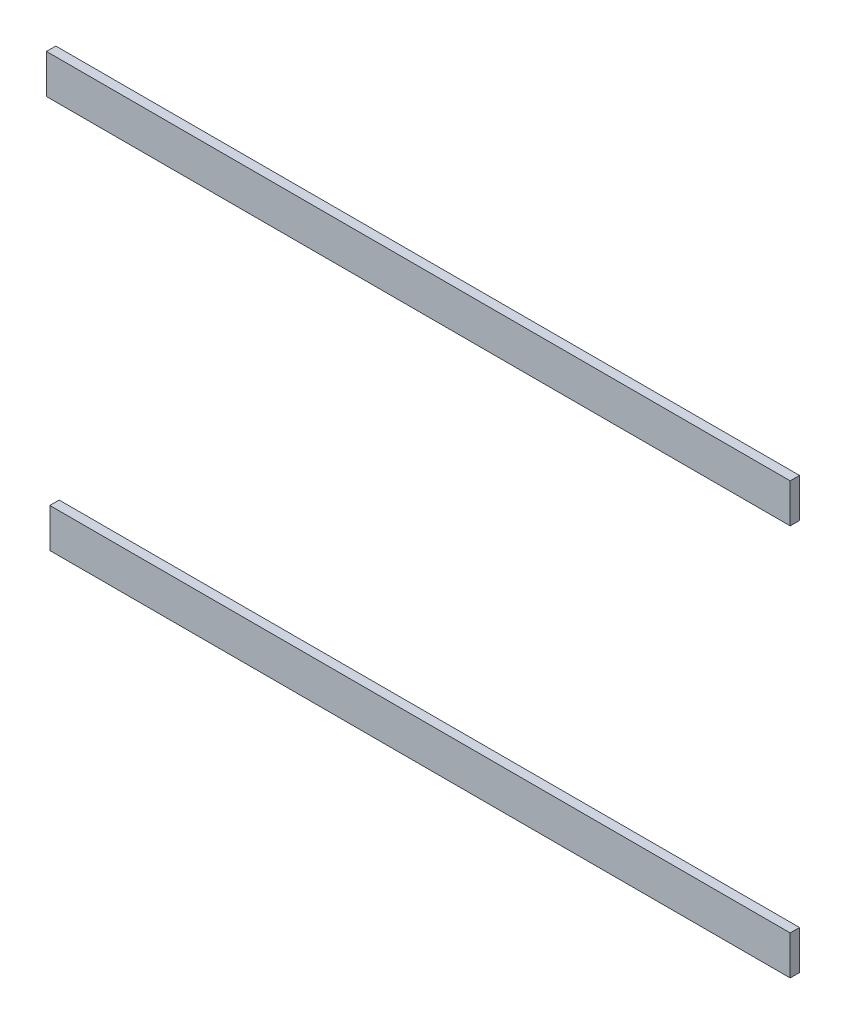
ISO-10303-21;
HEADER;
FILE_DESCRIPTION(('STEP AP214'),'2;1');
FILE_NAME('part.step','',(''),(''),'','','');
FILE_SCHEMA(('AUTOMOTIVE_DESIGN { 1 0 10303 214 1 1 1 1 }'));
ENDSEC;
DATA;
#1=APPLICATION_CONTEXT('core data for automotive mechanical design processes');
#2=APPLICATION_PROTOCOL_DEFINITION('international standard','automotive_design',2000,#1);
#3=PRODUCT_CONTEXT('',#1,'mechanical');
#4=PRODUCT('Part','Part','',(#3));
#5=PRODUCT_RELATED_PRODUCT_CATEGORY('part','',(#4));
#6=PRODUCT_DEFINITION_FORMATION('','',#4);
#7=PRODUCT_DEFINITION_CONTEXT('part definition',#1,'design');
#8=PRODUCT_DEFINITION('design','',#6,#7);
#9=PRODUCT_DEFINITION_SHAPE('','',#8);
#10=(LENGTH_UNIT() NAMED_UNIT(*) SI_UNIT(.MILLI.,.METRE.));
#11=(NAMED_UNIT(*) PLANE_ANGLE_UNIT() SI_UNIT($,.RADIAN.));
#12=(NAMED_UNIT(*) SI_UNIT($,.STERADIAN.) SOLID_ANGLE_UNIT());
#13=UNCERTAINTY_MEASURE_WITH_UNIT(LENGTH_MEASURE(1.E-05),#10,'distance_accuracy_value','');
#14=(GEOMETRIC_REPRESENTATION_CONTEXT(3) GLOBAL_UNCERTAINTY_ASSIGNED_CONTEXT((#13)) GLOBAL_UNIT_ASSIGNED_CONTEXT((#10,
#11,#12)) REPRESENTATION_CONTEXT('',''));
#15=CARTESIAN_POINT('',(0.,0.,0.));
#16=DIRECTION('',(0.,0.,1.));
#17=DIRECTION('',(1.,0.,0.));
#18=AXIS2_PLACEMENT_3D('',#15,#16,#17);
#19=CARTESIAN_POINT('',(0.,0.,1.2));
#20=DIRECTION('',(0.,0.,1.));
#21=DIRECTION('',(1.,0.,0.));
#22=AXIS2_PLACEMENT_3D('',#19,#20,#21);
#23=PLANE('',#22);
#24=DIRECTION('',(0.,-1.,0.));
#25=VECTOR('',#24,1.);
#26=CARTESIAN_POINT('',(-2.327676679514,60.577046,1.2));
#27=LINE('',#26,#25);
#28=CARTESIAN_POINT('',(-2.327676679514,60.577046,1.2));
#29=VERTEX_POINT('',#28);
#30=CARTESIAN_POINT('',(-2.327676679514,55.577046,1.2));
#31=VERTEX_POINT('',#30);
#32=EDGE_CURVE('P0_E11',#29,#31,#27,.T.);
#33=ORIENTED_EDGE('',*,*,#32,.T.);
#34=DIRECTION('',(1.,0.,0.));
#35=VECTOR('',#34,1.);
#36=CARTESIAN_POINT('',(-2.327676679514,55.577046,1.2));
#37=LINE('',#36,#35);
#38=CARTESIAN_POINT('',(92.92950262011,55.577046,1.2));
#39=VERTEX_POINT('',#38);
#40=EDGE_CURVE('P0_E20',#31,#39,#37,.T.);
#41=ORIENTED_EDGE('',*,*,#40,.T.);
#42=DIRECTION('',(0.,1.,0.));
#43=VECTOR('',#42,1.);
#44=CARTESIAN_POINT('',(92.92950262011,55.577046,1.2));
#45=LINE('',#44,#43);
#46=CARTESIAN_POINT('',(92.92950262011,60.577046,1.2));
#47=VERTEX_POINT('',#46);
#48=EDGE_CURVE('P0_E51',#39,#47,#45,.T.);
#49=ORIENTED_EDGE('',*,*,#48,.T.);
#50=DIRECTION('',(-1.,0.,0.));
#51=VECTOR('',#50,1.);
#52=CARTESIAN_POINT('',(92.92950262011,60.577046,1.2));
#53=LINE('',#52,#51);
#54=EDGE_CURVE('P0_E54',#47,#29,#53,.T.);
#55=ORIENTED_EDGE('',*,*,#54,.T.);
#56=EDGE_LOOP('',(#33,#41,#49,#55));
#57=FACE_BOUND('',#56,.T.);
#58=ADVANCED_FACE('P0_F17',(#57),#23,.T.);
#59=CARTESIAN_POINT('',(-2.327676679514,60.577046,0.));
#60=DIRECTION('',(-1.,0.,0.));
#61=DIRECTION('',(0.,0.,1.));
#62=AXIS2_PLACEMENT_3D('',#59,#60,#61);
#63=PLANE('',#62);
#64=DIRECTION('',(0.,0.,1.));
#65=VECTOR('',#64,1.);
#66=CARTESIAN_POINT('',(-2.327676679514,55.577046,0.));
#67=LINE('',#66,#65);
#68=CARTESIAN_POINT('',(-2.327676679514,55.577046,0.));
#69=VERTEX_POINT('',#68);
#70=EDGE_CURVE('P0_E27',#69,#31,#67,.T.);
#71=ORIENTED_EDGE('',*,*,#70,.T.);
#72=ORIENTED_EDGE('',*,*,#32,.F.);
#73=DIRECTION('',(0.,0.,1.));
#74=VECTOR('',#73,1.);
#75=CARTESIAN_POINT('',(-2.327676679514,60.577046,0.));
#76=LINE('',#75,#74);
#77=CARTESIAN_POINT('',(-2.327676679514,60.577046,0.));
#78=VERTEX_POINT('',#77);
#79=EDGE_CURVE('P0_E77',#78,#29,#76,.T.);
#80=ORIENTED_EDGE('',*,*,#79,.F.);
#81=DIRECTION('',(0.,-1.,0.));
#82=VECTOR('',#81,1.);
#83=CARTESIAN_POINT('',(-2.327676679514,60.577046,0.));
#84=LINE('',#83,#82);
#85=EDGE_CURVE('P0_E108',#78,#69,#84,.T.);
#86=ORIENTED_EDGE('',*,*,#85,.T.);
#87=EDGE_LOOP('',(#71,#72,#80,#86));
#88=FACE_BOUND('',#87,.T.);
#89=ADVANCED_FACE('P0_F118',(#88),#63,.T.);
#90=CARTESIAN_POINT('',(-2.327676679514,55.577046,0.));
#91=DIRECTION('',(0.,-1.,0.));
#92=DIRECTION('',(0.,0.,-1.));
#93=AXIS2_PLACEMENT_3D('',#90,#91,#92);
#94=PLANE('',#93);
#95=DIRECTION('',(0.,0.,1.));
#96=VECTOR('',#95,1.);
#97=CARTESIAN_POINT('',(92.92950262011,55.577046,0.));
#98=LINE('',#97,#96);
#99=CARTESIAN_POINT('',(92.92950262011,55.577046,0.));
#100=VERTEX_POINT('',#99);
#101=EDGE_CURVE('P0_E61',#100,#39,#98,.T.);
#102=ORIENTED_EDGE('',*,*,#101,.T.);
#103=ORIENTED_EDGE('',*,*,#40,.F.);
#104=ORIENTED_EDGE('',*,*,#70,.F.);
#105=DIRECTION('',(1.,0.,0.));
#106=VECTOR('',#105,1.);
#107=CARTESIAN_POINT('',(-2.327676679514,55.577046,0.));
#108=LINE('',#107,#106);
#109=EDGE_CURVE('P0_E105',#69,#100,#108,.T.);
#110=ORIENTED_EDGE('',*,*,#109,.T.);
#111=EDGE_LOOP('',(#102,#103,#104,#110));
#112=FACE_BOUND('',#111,.T.);
#113=ADVANCED_FACE('P0_F128',(#112),#94,.T.);
#114=CARTESIAN_POINT('',(92.92950262011,55.577046,0.));
#115=DIRECTION('',(1.,0.,0.));
#116=DIRECTION('',(0.,1.,0.));
#117=AXIS2_PLACEMENT_3D('',#114,#115,#116);
#118=PLANE('',#117);
#119=DIRECTION('',(0.,0.,1.));
#120=VECTOR('',#119,1.);
#121=CARTESIAN_POINT('',(92.92950262011,60.577046,0.));
#122=LINE('',#121,#120);
#123=CARTESIAN_POINT('',(92.92950262011,60.577046,0.));
#124=VERTEX_POINT('',#123);
#125=EDGE_CURVE('P0_E62',#124,#47,#122,.T.);
#126=ORIENTED_EDGE('',*,*,#125,.T.);
#127=ORIENTED_EDGE('',*,*,#48,.F.);
#128=ORIENTED_EDGE('',*,*,#101,.F.);
#129=DIRECTION('',(0.,1.,0.));
#130=VECTOR('',#129,1.);
#131=CARTESIAN_POINT('',(92.92950262011,55.577046,0.));
#132=LINE('',#131,#130);
#133=EDGE_CURVE('P0_E69',#100,#124,#132,.T.);
#134=ORIENTED_EDGE('',*,*,#133,.T.);
#135=EDGE_LOOP('',(#126,#127,#128,#134));
#136=FACE_BOUND('',#135,.T.);
#137=ADVANCED_FACE('P0_F66',(#136),#118,.T.);
#138=CARTESIAN_POINT('',(92.92950262011,60.577046,0.));
#139=DIRECTION('',(0.,1.,0.));
#140=DIRECTION('',(1.,0.,0.));
#141=AXIS2_PLACEMENT_3D('',#138,#139,#140);
#142=PLANE('',#141);
#143=ORIENTED_EDGE('',*,*,#79,.T.);
#144=ORIENTED_EDGE('',*,*,#54,.F.);
#145=ORIENTED_EDGE('',*,*,#125,.F.);
#146=DIRECTION('',(-1.,0.,0.));
#147=VECTOR('',#146,1.);
#148=CARTESIAN_POINT('',(92.92950262011,60.577046,0.));
#149=LINE('',#148,#147);
#150=EDGE_CURVE('P0_E84',#124,#78,#149,.T.);
#151=ORIENTED_EDGE('',*,*,#150,.T.);
#152=EDGE_LOOP('',(#143,#144,#145,#151));
#153=FACE_BOUND('',#152,.T.);
#154=ADVANCED_FACE('P0_F75',(#153),#142,.T.);
#155=CARTESIAN_POINT('',(0.,0.,0.));
#156=DIRECTION('',(0.,0.,1.));
#157=DIRECTION('',(1.,0.,0.));
#158=AXIS2_PLACEMENT_3D('',#155,#156,#157);
#159=PLANE('',#158);
#160=ORIENTED_EDGE('',*,*,#133,.F.);
#161=ORIENTED_EDGE('',*,*,#109,.F.);
#162=ORIENTED_EDGE('',*,*,#85,.F.);
#163=ORIENTED_EDGE('',*,*,#150,.F.);
#164=EDGE_LOOP('',(#160,#161,#162,#163));
#165=FACE_BOUND('',#164,.T.);
#166=ADVANCED_FACE('P0_F117',(#165),#159,.F.);
#167=CLOSED_SHELL('',(#58,#89,#113,#137,#154,#166));
#168=MANIFOLD_SOLID_BREP('P0_B1',#167);
#169=CARTESIAN_POINT('',(0.,0.,1.2));
#170=DIRECTION('',(0.,0.,1.));
#171=DIRECTION('',(1.,0.,0.));
#172=AXIS2_PLACEMENT_3D('',#169,#170,#171);
#173=PLANE('',#172);
#174=DIRECTION('',(0.,1.,0.));
#175=VECTOR('',#174,1.);
#176=CARTESIAN_POINT('',(92.92950262011,5.437046,1.2));
#177=LINE('',#176,#175);
#178=CARTESIAN_POINT('',(92.92950262011,5.437046,1.2));
#179=VERTEX_POINT('',#178);
#180=CARTESIAN_POINT('',(92.92950262011,10.437046,1.2));
#181=VERTEX_POINT('',#180);
#182=EDGE_CURVE('P1_E11',#179,#181,#177,.T.);
#183=ORIENTED_EDGE('',*,*,#182,.T.);
#184=DIRECTION('',(-1.,0.,0.));
#185=VECTOR('',#184,1.);
#186=CARTESIAN_POINT('',(92.92950262011,10.437046,1.2));
#187=LINE('',#186,#185);
#188=CARTESIAN_POINT('',(-1.895589174785,10.437046,1.2));
#189=VERTEX_POINT('',#188);
#190=EDGE_CURVE('P1_E44',#181,#189,#187,.T.);
#191=ORIENTED_EDGE('',*,*,#190,.T.);
#192=DIRECTION('',(0.,-1.,0.));
#193=VECTOR('',#192,1.);
#194=CARTESIAN_POINT('',(-1.895589174785,10.437046,1.2));
#195=LINE('',#194,#193);
#196=CARTESIAN_POINT('',(-1.895589174785,5.437046,1.2));
#197=VERTEX_POINT('',#196);
#198=EDGE_CURVE('P1_E109',#189,#197,#195,.T.);
#199=ORIENTED_EDGE('',*,*,#198,.T.);
#200=DIRECTION('',(1.,0.,0.));
#201=VECTOR('',#200,1.);
#202=CARTESIAN_POINT('',(-1.895589174785,5.437046,1.2));
#203=LINE('',#202,#201);
#204=EDGE_CURVE('P1_E99',#197,#179,#203,.T.);
#205=ORIENTED_EDGE('',*,*,#204,.T.);
#206=EDGE_LOOP('',(#183,#191,#199,#205));
#207=FACE_BOUND('',#206,.T.);
#208=ADVANCED_FACE('P1_F17',(#207),#173,.T.);
#209=CARTESIAN_POINT('',(92.92950262011,5.437046,0.));
#210=DIRECTION('',(1.,0.,0.));
#211=DIRECTION('',(0.,1.,0.));
#212=AXIS2_PLACEMENT_3D('',#209,#210,#211);
#213=PLANE('',#212);
#214=DIRECTION('',(0.,0.,1.));
#215=VECTOR('',#214,1.);
#216=CARTESIAN_POINT('',(92.92950262011,10.437046,0.));
#217=LINE('',#216,#215);
#218=CARTESIAN_POINT('',(92.92950262011,10.437046,0.));
#219=VERTEX_POINT('',#218);
#220=EDGE_CURVE('P1_E21',#219,#181,#217,.T.);
#221=ORIENTED_EDGE('',*,*,#220,.T.);
#222=ORIENTED_EDGE('',*,*,#182,.F.);
#223=DIRECTION('',(0.,0.,1.));
#224=VECTOR('',#223,1.);
#225=CARTESIAN_POINT('',(92.92950262011,5.437046,0.));
#226=LINE('',#225,#224);
#227=CARTESIAN_POINT('',(92.92950262011,5.437046,0.));
#228=VERTEX_POINT('',#227);
#229=EDGE_CURVE('P1_E80',#228,#179,#226,.T.);
#230=ORIENTED_EDGE('',*,*,#229,.F.);
#231=DIRECTION('',(0.,1.,0.));
#232=VECTOR('',#231,1.);
#233=CARTESIAN_POINT('',(92.92950262011,5.437046,0.));
#234=LINE('',#233,#232);
#235=EDGE_CURVE('P1_E78',#228,#219,#234,.T.);
#236=ORIENTED_EDGE('',*,*,#235,.T.);
#237=EDGE_LOOP('',(#221,#222,#230,#236));
#238=FACE_BOUND('',#237,.T.);
#239=ADVANCED_FACE('P1_F19',(#238),#213,.T.);
#240=CARTESIAN_POINT('',(92.92950262011,10.437046,0.));
#241=DIRECTION('',(0.,1.,0.));
#242=DIRECTION('',(1.,0.,0.));
#243=AXIS2_PLACEMENT_3D('',#240,#241,#242);
#244=PLANE('',#243);
#245=DIRECTION('',(0.,0.,1.));
#246=VECTOR('',#245,1.);
#247=CARTESIAN_POINT('',(-1.895589174785,10.437046,0.));
#248=LINE('',#247,#246);
#249=CARTESIAN_POINT('',(-1.895589174785,10.437046,0.));
#250=VERTEX_POINT('',#249);
#251=EDGE_CURVE('P1_E112',#250,#189,#248,.T.);
#252=ORIENTED_EDGE('',*,*,#251,.T.);
#253=ORIENTED_EDGE('',*,*,#190,.F.);
#254=ORIENTED_EDGE('',*,*,#220,.F.);
#255=DIRECTION('',(-1.,0.,0.));
#256=VECTOR('',#255,1.);
#257=CARTESIAN_POINT('',(92.92950262011,10.437046,0.));
#258=LINE('',#257,#256);
#259=EDGE_CURVE('P1_E73',#219,#250,#258,.T.);
#260=ORIENTED_EDGE('',*,*,#259,.T.);
#261=EDGE_LOOP('',(#252,#253,#254,#260));
#262=FACE_BOUND('',#261,.T.);
#263=ADVANCED_FACE('P1_F71',(#262),#244,.T.);
#264=CARTESIAN_POINT('',(-1.895589174785,10.437046,0.));
#265=DIRECTION('',(-1.,0.,0.));
#266=DIRECTION('',(0.,0.,1.));
#267=AXIS2_PLACEMENT_3D('',#264,#265,#266);
#268=PLANE('',#267);
#269=DIRECTION('',(0.,0.,1.));
#270=VECTOR('',#269,1.);
#271=CARTESIAN_POINT('',(-1.895589174785,5.437046,0.));
#272=LINE('',#271,#270);
#273=CARTESIAN_POINT('',(-1.895589174785,5.437046,0.));
#274=VERTEX_POINT('',#273);
#275=EDGE_CURVE('P1_E105',#274,#197,#272,.T.);
#276=ORIENTED_EDGE('',*,*,#275,.T.);
#277=ORIENTED_EDGE('',*,*,#198,.F.);
#278=ORIENTED_EDGE('',*,*,#251,.F.);
#279=DIRECTION('',(0.,-1.,0.));
#280=VECTOR('',#279,1.);
#281=CARTESIAN_POINT('',(-1.895589174785,10.437046,0.));
#282=LINE('',#281,#280);
#283=EDGE_CURVE('P1_E89',#250,#274,#282,.T.);
#284=ORIENTED_EDGE('',*,*,#283,.T.);
#285=EDGE_LOOP('',(#276,#277,#278,#284));
#286=FACE_BOUND('',#285,.T.);
#287=ADVANCED_FACE('P1_F141',(#286),#268,.T.);
#288=CARTESIAN_POINT('',(-1.895589174785,5.437046,0.));
#289=DIRECTION('',(0.,-1.,0.));
#290=DIRECTION('',(0.,0.,-1.));
#291=AXIS2_PLACEMENT_3D('',#288,#289,#290);
#292=PLANE('',#291);
#293=ORIENTED_EDGE('',*,*,#229,.T.);
#294=ORIENTED_EDGE('',*,*,#204,.F.);
#295=ORIENTED_EDGE('',*,*,#275,.F.);
#296=DIRECTION('',(1.,0.,0.));
#297=VECTOR('',#296,1.);
#298=CARTESIAN_POINT('',(-1.895589174785,5.437046,0.));
#299=LINE('',#298,#297);
#300=EDGE_CURVE('P1_E85',#274,#228,#299,.T.);
#301=ORIENTED_EDGE('',*,*,#300,.T.);
#302=EDGE_LOOP('',(#293,#294,#295,#301));
#303=FACE_BOUND('',#302,.T.);
#304=ADVANCED_FACE('P1_F146',(#303),#292,.T.);
#305=CARTESIAN_POINT('',(0.,0.,0.));
#306=DIRECTION('',(0.,0.,1.));
#307=DIRECTION('',(1.,0.,0.));
#308=AXIS2_PLACEMENT_3D('',#305,#306,#307);
#309=PLANE('',#308);
#310=ORIENTED_EDGE('',*,*,#283,.F.);
#311=ORIENTED_EDGE('',*,*,#259,.F.);
#312=ORIENTED_EDGE('',*,*,#235,.F.);
#313=ORIENTED_EDGE('',*,*,#300,.F.);
#314=EDGE_LOOP('',(#310,#311,#312,#313));
#315=FACE_BOUND('',#314,.T.);
#316=ADVANCED_FACE('P1_F87',(#315),#309,.F.);
#317=CLOSED_SHELL('',(#208,#239,#263,#287,#304,#316));
#318=MANIFOLD_SOLID_BREP('P1_B1',#317);
#319=ADVANCED_BREP_SHAPE_REPRESENTATION('',(#18,#168,#318),#14);
#320=SHAPE_DEFINITION_REPRESENTATION(#9,#319);
ENDSEC;
END-ISO-10303-21;
